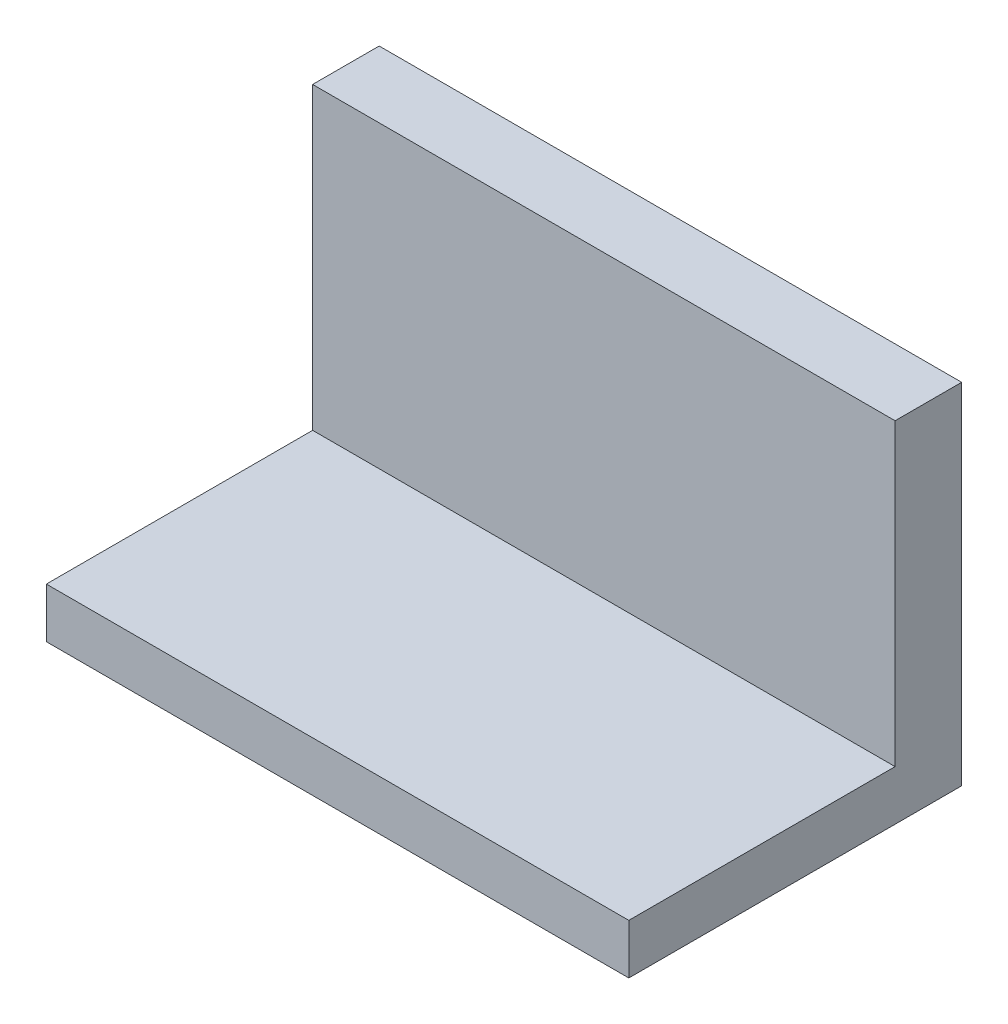
ISO-10303-21;
HEADER;
FILE_DESCRIPTION(('STEP AP214'),'2;1');
FILE_NAME('part.step','',(''),(''),'','','');
FILE_SCHEMA(('AUTOMOTIVE_DESIGN { 1 0 10303 214 1 1 1 1 }'));
ENDSEC;
DATA;
#1=APPLICATION_CONTEXT('core data for automotive mechanical design processes');
#2=APPLICATION_PROTOCOL_DEFINITION('international standard','automotive_design',2000,#1);
#3=PRODUCT_CONTEXT('',#1,'mechanical');
#4=PRODUCT('Part','Part','',(#3));
#5=PRODUCT_RELATED_PRODUCT_CATEGORY('part','',(#4));
#6=PRODUCT_DEFINITION_FORMATION('','',#4);
#7=PRODUCT_DEFINITION_CONTEXT('part definition',#1,'design');
#8=PRODUCT_DEFINITION('design','',#6,#7);
#9=PRODUCT_DEFINITION_SHAPE('','',#8);
#10=(LENGTH_UNIT() NAMED_UNIT(*) SI_UNIT(.MILLI.,.METRE.));
#11=(NAMED_UNIT(*) PLANE_ANGLE_UNIT() SI_UNIT($,.RADIAN.));
#12=(NAMED_UNIT(*) SI_UNIT($,.STERADIAN.) SOLID_ANGLE_UNIT());
#13=UNCERTAINTY_MEASURE_WITH_UNIT(LENGTH_MEASURE(1.E-05),#10,'distance_accuracy_value','');
#14=(GEOMETRIC_REPRESENTATION_CONTEXT(3) GLOBAL_UNCERTAINTY_ASSIGNED_CONTEXT((#13)) GLOBAL_UNIT_ASSIGNED_CONTEXT((#10,
#11,#12)) REPRESENTATION_CONTEXT('',''));
#15=CARTESIAN_POINT('',(0.,0.,0.));
#16=DIRECTION('',(0.,0.,1.));
#17=DIRECTION('',(1.,0.,0.));
#18=AXIS2_PLACEMENT_3D('',#15,#16,#17);
#19=CARTESIAN_POINT('',(-17.5,3.,0.));
#20=DIRECTION('',(-1.,0.,0.));
#21=DIRECTION('',(0.,0.,1.));
#22=AXIS2_PLACEMENT_3D('',#19,#20,#21);
#23=PLANE('',#22);
#24=DIRECTION('',(0.,0.,-1.));
#25=VECTOR('',#24,1.);
#26=CARTESIAN_POINT('',(-17.5,3.,0.));
#27=LINE('',#26,#25);
#28=CARTESIAN_POINT('',(-17.5,3.,10.));
#29=VERTEX_POINT('',#28);
#30=CARTESIAN_POINT('',(-17.5,3.,-6.));
#31=VERTEX_POINT('',#30);
#32=EDGE_CURVE('E99',#29,#31,#27,.T.);
#33=ORIENTED_EDGE('',*,*,#32,.T.);
#34=DIRECTION('',(0.,-1.,0.));
#35=VECTOR('',#34,1.);
#36=CARTESIAN_POINT('',(-17.5,21.,-6.));
#37=LINE('',#36,#35);
#38=CARTESIAN_POINT('',(-17.5,21.,-6.));
#39=VERTEX_POINT('',#38);
#40=EDGE_CURVE('E117',#39,#31,#37,.T.);
#41=ORIENTED_EDGE('',*,*,#40,.F.);
#42=DIRECTION('',(0.,0.,-1.));
#43=VECTOR('',#42,1.);
#44=CARTESIAN_POINT('',(-17.5,21.,0.));
#45=LINE('',#44,#43);
#46=CARTESIAN_POINT('',(-17.5,21.,-10.));
#47=VERTEX_POINT('',#46);
#48=EDGE_CURVE('E91',#39,#47,#45,.T.);
#49=ORIENTED_EDGE('',*,*,#48,.T.);
#50=DIRECTION('',(0.,-1.,0.));
#51=VECTOR('',#50,1.);
#52=CARTESIAN_POINT('',(-17.5,3.,-10.));
#53=LINE('',#52,#51);
#54=CARTESIAN_POINT('',(-17.5,0.,-10.));
#55=VERTEX_POINT('',#54);
#56=EDGE_CURVE('E86',#47,#55,#53,.T.);
#57=ORIENTED_EDGE('',*,*,#56,.T.);
#58=DIRECTION('',(0.,0.,-1.));
#59=VECTOR('',#58,1.);
#60=CARTESIAN_POINT('',(-17.5,0.,0.));
#61=LINE('',#60,#59);
#62=CARTESIAN_POINT('',(-17.5,0.,10.));
#63=VERTEX_POINT('',#62);
#64=EDGE_CURVE('E75',#63,#55,#61,.T.);
#65=ORIENTED_EDGE('',*,*,#64,.F.);
#66=DIRECTION('',(0.,-1.,0.));
#67=VECTOR('',#66,1.);
#68=CARTESIAN_POINT('',(-17.5,3.,10.));
#69=LINE('',#68,#67);
#70=EDGE_CURVE('E11',#29,#63,#69,.T.);
#71=ORIENTED_EDGE('',*,*,#70,.F.);
#72=EDGE_LOOP('',(#33,#41,#49,#57,#65,#71));
#73=FACE_BOUND('',#72,.T.);
#74=ADVANCED_FACE('F35',(#73),#23,.T.);
#75=CARTESIAN_POINT('',(0.,3.,10.));
#76=DIRECTION('',(0.,0.,-1.));
#77=DIRECTION('',(-1.,0.,0.));
#78=AXIS2_PLACEMENT_3D('',#75,#76,#77);
#79=PLANE('',#78);
#80=DIRECTION('',(1.,0.,0.));
#81=VECTOR('',#80,1.);
#82=CARTESIAN_POINT('',(0.,0.,10.));
#83=LINE('',#82,#81);
#84=CARTESIAN_POINT('',(17.5,0.,10.));
#85=VERTEX_POINT('',#84);
#86=EDGE_CURVE('E80',#63,#85,#83,.T.);
#87=ORIENTED_EDGE('',*,*,#86,.T.);
#88=DIRECTION('',(0.,-1.,0.));
#89=VECTOR('',#88,1.);
#90=CARTESIAN_POINT('',(17.5,3.,10.));
#91=LINE('',#90,#89);
#92=CARTESIAN_POINT('',(17.5,3.,10.));
#93=VERTEX_POINT('',#92);
#94=EDGE_CURVE('E43',#93,#85,#91,.T.);
#95=ORIENTED_EDGE('',*,*,#94,.F.);
#96=DIRECTION('',(1.,0.,0.));
#97=VECTOR('',#96,1.);
#98=CARTESIAN_POINT('',(0.,3.,10.));
#99=LINE('',#98,#97);
#100=EDGE_CURVE('E51',#29,#93,#99,.T.);
#101=ORIENTED_EDGE('',*,*,#100,.F.);
#102=ORIENTED_EDGE('',*,*,#70,.T.);
#103=EDGE_LOOP('',(#87,#95,#101,#102));
#104=FACE_BOUND('',#103,.T.);
#105=ADVANCED_FACE('F109',(#104),#79,.F.);
#106=CARTESIAN_POINT('',(17.5,3.,0.));
#107=DIRECTION('',(-1.,0.,0.));
#108=DIRECTION('',(0.,0.,1.));
#109=AXIS2_PLACEMENT_3D('',#106,#107,#108);
#110=PLANE('',#109);
#111=DIRECTION('',(0.,0.,-1.));
#112=VECTOR('',#111,1.);
#113=CARTESIAN_POINT('',(17.5,0.,0.));
#114=LINE('',#113,#112);
#115=CARTESIAN_POINT('',(17.5,0.,-10.));
#116=VERTEX_POINT('',#115);
#117=EDGE_CURVE('E68',#85,#116,#114,.T.);
#118=ORIENTED_EDGE('',*,*,#117,.T.);
#119=DIRECTION('',(0.,-1.,0.));
#120=VECTOR('',#119,1.);
#121=CARTESIAN_POINT('',(17.5,3.,-10.));
#122=LINE('',#121,#120);
#123=CARTESIAN_POINT('',(17.5,21.,-10.));
#124=VERTEX_POINT('',#123);
#125=EDGE_CURVE('E95',#124,#116,#122,.T.);
#126=ORIENTED_EDGE('',*,*,#125,.F.);
#127=DIRECTION('',(0.,0.,-1.));
#128=VECTOR('',#127,1.);
#129=CARTESIAN_POINT('',(17.5,21.,0.));
#130=LINE('',#129,#128);
#131=CARTESIAN_POINT('',(17.5,21.,-6.));
#132=VERTEX_POINT('',#131);
#133=EDGE_CURVE('E123',#132,#124,#130,.T.);
#134=ORIENTED_EDGE('',*,*,#133,.F.);
#135=DIRECTION('',(0.,-1.,0.));
#136=VECTOR('',#135,1.);
#137=CARTESIAN_POINT('',(17.5,21.,-6.));
#138=LINE('',#137,#136);
#139=CARTESIAN_POINT('',(17.5,3.,-6.));
#140=VERTEX_POINT('',#139);
#141=EDGE_CURVE('E115',#132,#140,#138,.T.);
#142=ORIENTED_EDGE('',*,*,#141,.T.);
#143=DIRECTION('',(0.,0.,-1.));
#144=VECTOR('',#143,1.);
#145=CARTESIAN_POINT('',(17.5,3.,0.));
#146=LINE('',#145,#144);
#147=EDGE_CURVE('E96',#93,#140,#146,.T.);
#148=ORIENTED_EDGE('',*,*,#147,.F.);
#149=ORIENTED_EDGE('',*,*,#94,.T.);
#150=EDGE_LOOP('',(#118,#126,#134,#142,#148,#149));
#151=FACE_BOUND('',#150,.T.);
#152=ADVANCED_FACE('F106',(#151),#110,.F.);
#153=CARTESIAN_POINT('',(0.,3.,-10.));
#154=DIRECTION('',(0.,0.,-1.));
#155=DIRECTION('',(-1.,0.,0.));
#156=AXIS2_PLACEMENT_3D('',#153,#154,#155);
#157=PLANE('',#156);
#158=DIRECTION('',(1.,0.,0.));
#159=VECTOR('',#158,1.);
#160=CARTESIAN_POINT('',(0.,0.,-10.));
#161=LINE('',#160,#159);
#162=EDGE_CURVE('E79',#55,#116,#161,.T.);
#163=ORIENTED_EDGE('',*,*,#162,.F.);
#164=ORIENTED_EDGE('',*,*,#56,.F.);
#165=DIRECTION('',(1.,0.,0.));
#166=VECTOR('',#165,1.);
#167=CARTESIAN_POINT('',(0.,21.,-10.));
#168=LINE('',#167,#166);
#169=EDGE_CURVE('E121',#47,#124,#168,.T.);
#170=ORIENTED_EDGE('',*,*,#169,.T.);
#171=ORIENTED_EDGE('',*,*,#125,.T.);
#172=EDGE_LOOP('',(#163,#164,#170,#171));
#173=FACE_BOUND('',#172,.T.);
#174=ADVANCED_FACE('F98',(#173),#157,.T.);
#175=CARTESIAN_POINT('',(0.,3.,0.));
#176=DIRECTION('',(0.,1.,0.));
#177=DIRECTION('',(0.,0.,1.));
#178=AXIS2_PLACEMENT_3D('',#175,#176,#177);
#179=PLANE('',#178);
#180=DIRECTION('',(1.,0.,0.));
#181=VECTOR('',#180,1.);
#182=CARTESIAN_POINT('',(0.,3.,-6.));
#183=LINE('',#182,#181);
#184=EDGE_CURVE('E82',#31,#140,#183,.T.);
#185=ORIENTED_EDGE('',*,*,#184,.F.);
#186=ORIENTED_EDGE('',*,*,#32,.F.);
#187=ORIENTED_EDGE('',*,*,#100,.T.);
#188=ORIENTED_EDGE('',*,*,#147,.T.);
#189=EDGE_LOOP('',(#185,#186,#187,#188));
#190=FACE_BOUND('',#189,.T.);
#191=ADVANCED_FACE('F145',(#190),#179,.T.);
#192=CARTESIAN_POINT('',(0.,0.,0.));
#193=DIRECTION('',(0.,1.,0.));
#194=DIRECTION('',(0.,0.,1.));
#195=AXIS2_PLACEMENT_3D('',#192,#193,#194);
#196=PLANE('',#195);
#197=ORIENTED_EDGE('',*,*,#64,.T.);
#198=ORIENTED_EDGE('',*,*,#162,.T.);
#199=ORIENTED_EDGE('',*,*,#117,.F.);
#200=ORIENTED_EDGE('',*,*,#86,.F.);
#201=EDGE_LOOP('',(#197,#198,#199,#200));
#202=FACE_BOUND('',#201,.T.);
#203=ADVANCED_FACE('F77',(#202),#196,.F.);
#204=CARTESIAN_POINT('',(0.,21.,-6.));
#205=DIRECTION('',(0.,0.,1.));
#206=DIRECTION('',(1.,0.,0.));
#207=AXIS2_PLACEMENT_3D('',#204,#205,#206);
#208=PLANE('',#207);
#209=ORIENTED_EDGE('',*,*,#40,.T.);
#210=ORIENTED_EDGE('',*,*,#184,.T.);
#211=ORIENTED_EDGE('',*,*,#141,.F.);
#212=DIRECTION('',(-1.,0.,0.));
#213=VECTOR('',#212,1.);
#214=CARTESIAN_POINT('',(0.,21.,-6.));
#215=LINE('',#214,#213);
#216=EDGE_CURVE('E126',#132,#39,#215,.T.);
#217=ORIENTED_EDGE('',*,*,#216,.T.);
#218=EDGE_LOOP('',(#209,#210,#211,#217));
#219=FACE_BOUND('',#218,.T.);
#220=ADVANCED_FACE('F132',(#219),#208,.T.);
#221=CARTESIAN_POINT('',(0.,21.,0.));
#222=DIRECTION('',(0.,1.,0.));
#223=DIRECTION('',(0.,0.,1.));
#224=AXIS2_PLACEMENT_3D('',#221,#222,#223);
#225=PLANE('',#224);
#226=ORIENTED_EDGE('',*,*,#216,.F.);
#227=ORIENTED_EDGE('',*,*,#133,.T.);
#228=ORIENTED_EDGE('',*,*,#169,.F.);
#229=ORIENTED_EDGE('',*,*,#48,.F.);
#230=EDGE_LOOP('',(#226,#227,#228,#229));
#231=FACE_BOUND('',#230,.T.);
#232=ADVANCED_FACE('F139',(#231),#225,.T.);
#233=CLOSED_SHELL('',(#74,#105,#152,#174,#191,#203,#220,#232));
#234=MANIFOLD_SOLID_BREP('B2',#233);
#235=ADVANCED_BREP_SHAPE_REPRESENTATION('',(#18,#234),#14);
#236=SHAPE_DEFINITION_REPRESENTATION(#9,#235);
ENDSEC;
END-ISO-10303-21;
